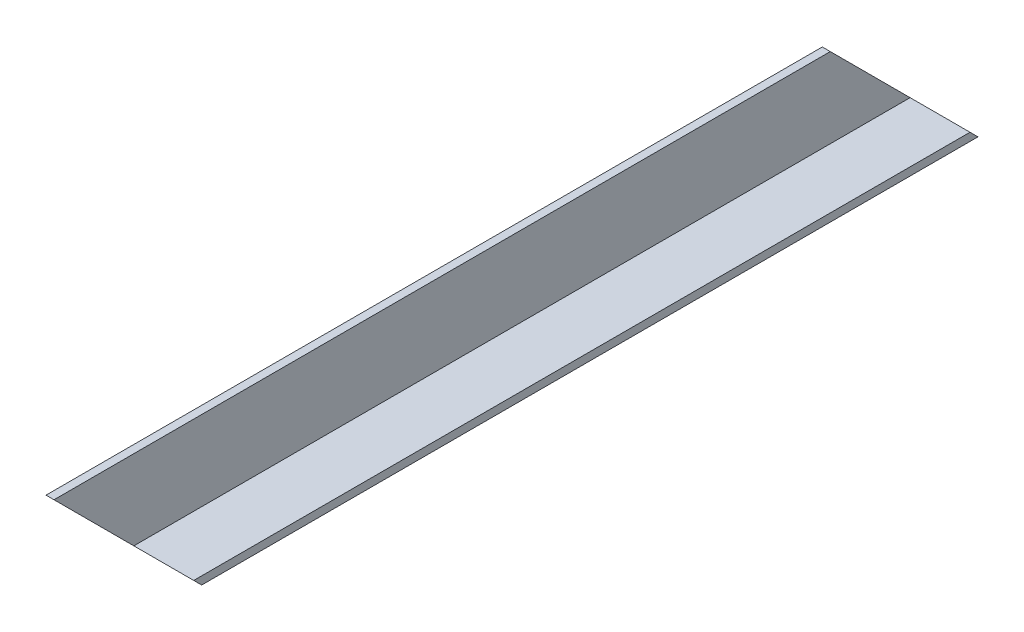
ISO-10303-21;
HEADER;
FILE_DESCRIPTION(('STEP AP214'),'2;1');
FILE_NAME('part.step','',(''),(''),'','','');
FILE_SCHEMA(('AUTOMOTIVE_DESIGN { 1 0 10303 214 1 1 1 1 }'));
ENDSEC;
DATA;
#1=APPLICATION_CONTEXT('core data for automotive mechanical design processes');
#2=APPLICATION_PROTOCOL_DEFINITION('international standard','automotive_design',2000,#1);
#3=PRODUCT_CONTEXT('',#1,'mechanical');
#4=PRODUCT('Part','Part','',(#3));
#5=PRODUCT_RELATED_PRODUCT_CATEGORY('part','',(#4));
#6=PRODUCT_DEFINITION_FORMATION('','',#4);
#7=PRODUCT_DEFINITION_CONTEXT('part definition',#1,'design');
#8=PRODUCT_DEFINITION('design','',#6,#7);
#9=PRODUCT_DEFINITION_SHAPE('','',#8);
#10=(LENGTH_UNIT() NAMED_UNIT(*) SI_UNIT(.MILLI.,.METRE.));
#11=(NAMED_UNIT(*) PLANE_ANGLE_UNIT() SI_UNIT($,.RADIAN.));
#12=(NAMED_UNIT(*) SI_UNIT($,.STERADIAN.) SOLID_ANGLE_UNIT());
#13=UNCERTAINTY_MEASURE_WITH_UNIT(LENGTH_MEASURE(1.E-05),#10,'distance_accuracy_value','');
#14=(GEOMETRIC_REPRESENTATION_CONTEXT(3) GLOBAL_UNCERTAINTY_ASSIGNED_CONTEXT((#13)) GLOBAL_UNIT_ASSIGNED_CONTEXT((#10,
#11,#12)) REPRESENTATION_CONTEXT('',''));
#15=CARTESIAN_POINT('',(0.,0.,0.));
#16=DIRECTION('',(0.,0.,1.));
#17=DIRECTION('',(1.,0.,0.));
#18=AXIS2_PLACEMENT_3D('',#15,#16,#17);
#19=CARTESIAN_POINT('',(17.,0.,250.));
#20=DIRECTION('',(0.,1.,0.));
#21=DIRECTION('',(-1.,0.,0.));
#22=AXIS2_PLACEMENT_3D('',#19,#20,#21);
#23=PLANE('',#22);
#24=DIRECTION('',(0.,0.,-1.));
#25=VECTOR('',#24,1.);
#26=CARTESIAN_POINT('',(17.,0.,250.));
#27=LINE('',#26,#25);
#28=CARTESIAN_POINT('',(17.,0.,194.4543648263));
#29=VERTEX_POINT('',#28);
#30=CARTESIAN_POINT('',(17.,0.,0.));
#31=VERTEX_POINT('',#30);
#32=EDGE_CURVE('E48',#29,#31,#27,.T.);
#33=ORIENTED_EDGE('',*,*,#32,.F.);
#34=DIRECTION('',(1.,0.,0.));
#35=VECTOR('',#34,1.);
#36=CARTESIAN_POINT('',(-133.,0.,194.4543648263));
#37=LINE('',#36,#35);
#38=CARTESIAN_POINT('',(0.,0.,194.4543648263));
#39=VERTEX_POINT('',#38);
#40=EDGE_CURVE('E90',#39,#29,#37,.T.);
#41=ORIENTED_EDGE('',*,*,#40,.F.);
#42=DIRECTION('',(0.,0.,-1.));
#43=VECTOR('',#42,1.);
#44=CARTESIAN_POINT('',(0.,0.,250.));
#45=LINE('',#44,#43);
#46=CARTESIAN_POINT('',(0.,0.,0.));
#47=VERTEX_POINT('',#46);
#48=EDGE_CURVE('E119',#39,#47,#45,.T.);
#49=ORIENTED_EDGE('',*,*,#48,.T.);
#50=DIRECTION('',(1.,0.,0.));
#51=VECTOR('',#50,1.);
#52=CARTESIAN_POINT('',(17.,0.,0.));
#53=LINE('',#52,#51);
#54=EDGE_CURVE('E107',#47,#31,#53,.T.);
#55=ORIENTED_EDGE('',*,*,#54,.T.);
#56=EDGE_LOOP('',(#33,#41,#49,#55));
#57=FACE_BOUND('',#56,.T.);
#58=ADVANCED_FACE('F41',(#57),#23,.F.);
#59=CARTESIAN_POINT('',(17.,2.,250.));
#60=DIRECTION('',(-1.,0.,0.));
#61=DIRECTION('',(0.,0.,1.));
#62=AXIS2_PLACEMENT_3D('',#59,#60,#61);
#63=PLANE('',#62);
#64=ORIENTED_EDGE('',*,*,#32,.T.);
#65=DIRECTION('',(0.,-0.707106781186551,-0.707106781186544));
#66=VECTOR('',#65,1.);
#67=CARTESIAN_POINT('',(17.,0.,0.));
#68=LINE('',#67,#66);
#69=CARTESIAN_POINT('',(17.,1.99999999999999,1.99999999999997));
#70=VERTEX_POINT('',#69);
#71=EDGE_CURVE('E62',#70,#31,#68,.T.);
#72=ORIENTED_EDGE('',*,*,#71,.F.);
#73=DIRECTION('',(0.,0.,-1.));
#74=VECTOR('',#73,1.);
#75=CARTESIAN_POINT('',(17.,2.,250.));
#76=LINE('',#75,#74);
#77=CARTESIAN_POINT('',(17.,2.,196.4543648263));
#78=VERTEX_POINT('',#77);
#79=EDGE_CURVE('E105',#78,#70,#76,.T.);
#80=ORIENTED_EDGE('',*,*,#79,.F.);
#81=DIRECTION('',(0.,0.707106781186551,0.707106781186544));
#82=VECTOR('',#81,1.);
#83=CARTESIAN_POINT('',(17.,22.,216.454364826299));
#84=LINE('',#83,#82);
#85=EDGE_CURVE('E93',#29,#78,#84,.T.);
#86=ORIENTED_EDGE('',*,*,#85,.F.);
#87=EDGE_LOOP('',(#64,#72,#80,#86));
#88=FACE_BOUND('',#87,.T.);
#89=ADVANCED_FACE('F102',(#88),#63,.F.);
#90=CARTESIAN_POINT('',(2.,2.,250.));
#91=DIRECTION('',(0.,-1.,0.));
#92=DIRECTION('',(0.,0.,-1.));
#93=AXIS2_PLACEMENT_3D('',#90,#91,#92);
#94=PLANE('',#93);
#95=ORIENTED_EDGE('',*,*,#79,.T.);
#96=DIRECTION('',(-1.,0.,0.));
#97=VECTOR('',#96,1.);
#98=CARTESIAN_POINT('',(2.,2.,1.99999999999997));
#99=LINE('',#98,#97);
#100=CARTESIAN_POINT('',(2.,2.,1.99999999999997));
#101=VERTEX_POINT('',#100);
#102=EDGE_CURVE('E127',#70,#101,#99,.T.);
#103=ORIENTED_EDGE('',*,*,#102,.T.);
#104=DIRECTION('',(0.,0.,-1.));
#105=VECTOR('',#104,1.);
#106=CARTESIAN_POINT('',(2.,2.,250.));
#107=LINE('',#106,#105);
#108=CARTESIAN_POINT('',(2.,2.,196.4543648263));
#109=VERTEX_POINT('',#108);
#110=EDGE_CURVE('E108',#109,#101,#107,.T.);
#111=ORIENTED_EDGE('',*,*,#110,.F.);
#112=DIRECTION('',(1.,0.,0.));
#113=VECTOR('',#112,1.);
#114=CARTESIAN_POINT('',(2.,2.,196.4543648263));
#115=LINE('',#114,#113);
#116=EDGE_CURVE('E122',#109,#78,#115,.T.);
#117=ORIENTED_EDGE('',*,*,#116,.T.);
#118=EDGE_LOOP('',(#95,#103,#111,#117));
#119=FACE_BOUND('',#118,.T.);
#120=ADVANCED_FACE('F163',(#119),#94,.F.);
#121=CARTESIAN_POINT('',(2.,22.,250.));
#122=DIRECTION('',(-1.,0.,0.));
#123=DIRECTION('',(0.,-1.,0.));
#124=AXIS2_PLACEMENT_3D('',#121,#122,#123);
#125=PLANE('',#124);
#126=ORIENTED_EDGE('',*,*,#110,.T.);
#127=DIRECTION('',(0.,0.707106781186551,0.707106781186544));
#128=VECTOR('',#127,1.);
#129=CARTESIAN_POINT('',(1.99999999999999,136.,135.999999999999));
#130=LINE('',#129,#128);
#131=CARTESIAN_POINT('',(2.,22.,21.9999999999998));
#132=VERTEX_POINT('',#131);
#133=EDGE_CURVE('E130',#101,#132,#130,.T.);
#134=ORIENTED_EDGE('',*,*,#133,.T.);
#135=DIRECTION('',(0.,0.,-1.));
#136=VECTOR('',#135,1.);
#137=CARTESIAN_POINT('',(2.,22.,250.));
#138=LINE('',#137,#136);
#139=CARTESIAN_POINT('',(2.,22.,216.454364826299));
#140=VERTEX_POINT('',#139);
#141=EDGE_CURVE('E113',#140,#132,#138,.T.);
#142=ORIENTED_EDGE('',*,*,#141,.F.);
#143=DIRECTION('',(0.,-0.707106781186551,-0.707106781186544));
#144=VECTOR('',#143,1.);
#145=CARTESIAN_POINT('',(2.,38.7728175868503,233.22718241315));
#146=LINE('',#145,#144);
#147=EDGE_CURVE('E124',#140,#109,#146,.T.);
#148=ORIENTED_EDGE('',*,*,#147,.T.);
#149=EDGE_LOOP('',(#126,#134,#142,#148));
#150=FACE_BOUND('',#149,.T.);
#151=ADVANCED_FACE('F145',(#150),#125,.F.);
#152=CARTESIAN_POINT('',(0.,22.,250.));
#153=DIRECTION('',(0.,-1.,0.));
#154=DIRECTION('',(0.,0.,-1.));
#155=AXIS2_PLACEMENT_3D('',#152,#153,#154);
#156=PLANE('',#155);
#157=ORIENTED_EDGE('',*,*,#141,.T.);
#158=DIRECTION('',(1.,0.,0.));
#159=VECTOR('',#158,1.);
#160=CARTESIAN_POINT('',(-133.,22.,21.9999999999998));
#161=LINE('',#160,#159);
#162=CARTESIAN_POINT('',(0.,22.,21.9999999999998));
#163=VERTEX_POINT('',#162);
#164=EDGE_CURVE('E135',#163,#132,#161,.T.);
#165=ORIENTED_EDGE('',*,*,#164,.F.);
#166=DIRECTION('',(0.,0.,-1.));
#167=VECTOR('',#166,1.);
#168=CARTESIAN_POINT('',(0.,22.,250.));
#169=LINE('',#168,#167);
#170=CARTESIAN_POINT('',(0.,22.,216.454364826299));
#171=VERTEX_POINT('',#170);
#172=EDGE_CURVE('E116',#171,#163,#169,.T.);
#173=ORIENTED_EDGE('',*,*,#172,.F.);
#174=DIRECTION('',(1.,0.,0.));
#175=VECTOR('',#174,1.);
#176=CARTESIAN_POINT('',(-133.,22.,216.454364826299));
#177=LINE('',#176,#175);
#178=EDGE_CURVE('E55',#171,#140,#177,.T.);
#179=ORIENTED_EDGE('',*,*,#178,.T.);
#180=EDGE_LOOP('',(#157,#165,#173,#179));
#181=FACE_BOUND('',#180,.T.);
#182=ADVANCED_FACE('F147',(#181),#156,.F.);
#183=CARTESIAN_POINT('',(0.,0.,250.));
#184=DIRECTION('',(1.,0.,0.));
#185=DIRECTION('',(0.,0.,-1.));
#186=AXIS2_PLACEMENT_3D('',#183,#184,#185);
#187=PLANE('',#186);
#188=ORIENTED_EDGE('',*,*,#172,.T.);
#189=DIRECTION('',(0.,-0.707106781186551,-0.707106781186544));
#190=VECTOR('',#189,1.);
#191=CARTESIAN_POINT('',(0.,125.,124.999999999999));
#192=LINE('',#191,#190);
#193=EDGE_CURVE('E133',#163,#47,#192,.T.);
#194=ORIENTED_EDGE('',*,*,#193,.T.);
#195=ORIENTED_EDGE('',*,*,#48,.F.);
#196=DIRECTION('',(0.,0.707106781186551,0.707106781186544));
#197=VECTOR('',#196,1.);
#198=CARTESIAN_POINT('',(0.,27.7728175868502,222.22718241315));
#199=LINE('',#198,#197);
#200=EDGE_CURVE('E11',#39,#171,#199,.T.);
#201=ORIENTED_EDGE('',*,*,#200,.T.);
#202=EDGE_LOOP('',(#188,#194,#195,#201));
#203=FACE_BOUND('',#202,.T.);
#204=ADVANCED_FACE('F149',(#203),#187,.F.);
#205=CARTESIAN_POINT('',(-133.,0.,0.));
#206=DIRECTION('',(0.,-0.707106781186544,0.707106781186551));
#207=DIRECTION('',(0.,-0.707106781186551,-0.707106781186544));
#208=AXIS2_PLACEMENT_3D('',#205,#206,#207);
#209=PLANE('',#208);
#210=ORIENTED_EDGE('',*,*,#71,.T.);
#211=ORIENTED_EDGE('',*,*,#54,.F.);
#212=ORIENTED_EDGE('',*,*,#193,.F.);
#213=ORIENTED_EDGE('',*,*,#164,.T.);
#214=ORIENTED_EDGE('',*,*,#133,.F.);
#215=ORIENTED_EDGE('',*,*,#102,.F.);
#216=EDGE_LOOP('',(#210,#211,#212,#213,#214,#215));
#217=FACE_BOUND('',#216,.T.);
#218=ADVANCED_FACE('F140',(#217),#209,.F.);
#219=CARTESIAN_POINT('',(-133.,22.,216.454364826299));
#220=DIRECTION('',(0.,0.707106781186544,-0.707106781186551));
#221=DIRECTION('',(0.,0.707106781186551,0.707106781186544));
#222=AXIS2_PLACEMENT_3D('',#219,#220,#221);
#223=PLANE('',#222);
#224=ORIENTED_EDGE('',*,*,#147,.F.);
#225=ORIENTED_EDGE('',*,*,#178,.F.);
#226=ORIENTED_EDGE('',*,*,#200,.F.);
#227=ORIENTED_EDGE('',*,*,#40,.T.);
#228=ORIENTED_EDGE('',*,*,#85,.T.);
#229=ORIENTED_EDGE('',*,*,#116,.F.);
#230=EDGE_LOOP('',(#224,#225,#226,#227,#228,#229));
#231=FACE_BOUND('',#230,.T.);
#232=ADVANCED_FACE('F92',(#231),#223,.F.);
#233=CLOSED_SHELL('',(#58,#89,#120,#151,#182,#204,#218,#232));
#234=MANIFOLD_SOLID_BREP('B2',#233);
#235=ADVANCED_BREP_SHAPE_REPRESENTATION('',(#18,#234),#14);
#236=SHAPE_DEFINITION_REPRESENTATION(#9,#235);
ENDSEC;
END-ISO-10303-21;
